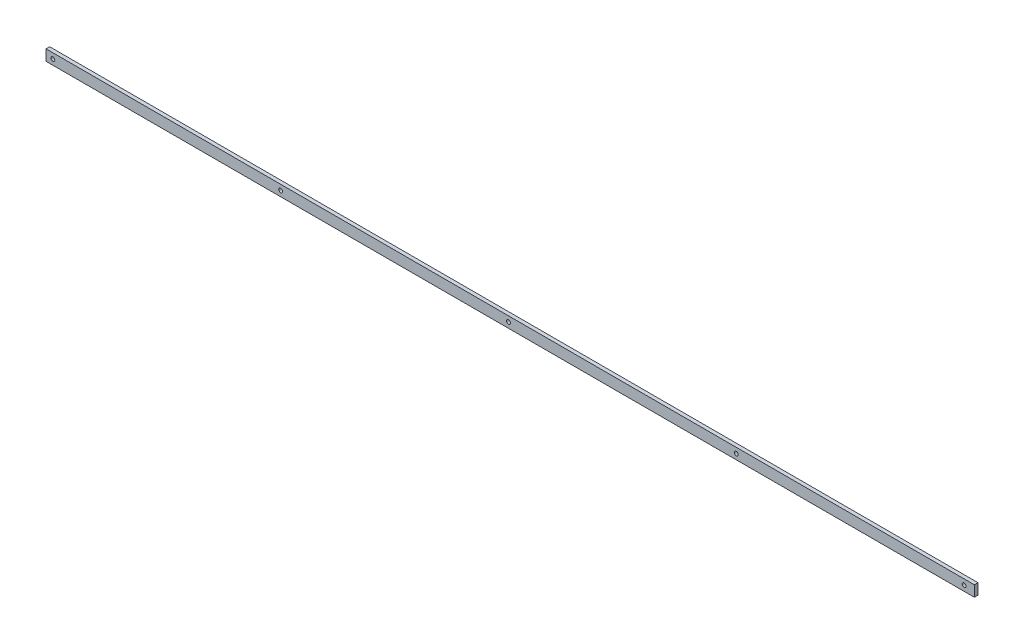
ISO-10303-21;
HEADER;
FILE_DESCRIPTION(('STEP AP214'),'2;1');
FILE_NAME('part.step','',(''),(''),'','','');
FILE_SCHEMA(('AUTOMOTIVE_DESIGN { 1 0 10303 214 1 1 1 1 }'));
ENDSEC;
DATA;
#1=APPLICATION_CONTEXT('core data for automotive mechanical design processes');
#2=APPLICATION_PROTOCOL_DEFINITION('international standard','automotive_design',2000,#1);
#3=PRODUCT_CONTEXT('',#1,'mechanical');
#4=PRODUCT('Part','Part','',(#3));
#5=PRODUCT_RELATED_PRODUCT_CATEGORY('part','',(#4));
#6=PRODUCT_DEFINITION_FORMATION('','',#4);
#7=PRODUCT_DEFINITION_CONTEXT('part definition',#1,'design');
#8=PRODUCT_DEFINITION('design','',#6,#7);
#9=PRODUCT_DEFINITION_SHAPE('','',#8);
#10=(LENGTH_UNIT() NAMED_UNIT(*) SI_UNIT(.MILLI.,.METRE.));
#11=(NAMED_UNIT(*) PLANE_ANGLE_UNIT() SI_UNIT($,.RADIAN.));
#12=(NAMED_UNIT(*) SI_UNIT($,.STERADIAN.) SOLID_ANGLE_UNIT());
#13=UNCERTAINTY_MEASURE_WITH_UNIT(LENGTH_MEASURE(1.E-05),#10,'distance_accuracy_value','');
#14=(GEOMETRIC_REPRESENTATION_CONTEXT(3) GLOBAL_UNCERTAINTY_ASSIGNED_CONTEXT((#13)) GLOBAL_UNIT_ASSIGNED_CONTEXT((#10,
#11,#12)) REPRESENTATION_CONTEXT('',''));
#15=CARTESIAN_POINT('',(0.,0.,0.));
#16=DIRECTION('',(0.,0.,1.));
#17=DIRECTION('',(1.,0.,0.));
#18=AXIS2_PLACEMENT_3D('',#15,#16,#17);
#19=CARTESIAN_POINT('',(-93.9029108738828,-23.0037735849057,6.35));
#20=DIRECTION('',(0.,1.,0.));
#21=DIRECTION('',(-1.,0.,0.));
#22=AXIS2_PLACEMENT_3D('',#19,#20,#21);
#23=PLANE('',#22);
#24=DIRECTION('',(1.,0.,0.));
#25=VECTOR('',#24,1.);
#26=CARTESIAN_POINT('',(-93.9029108738828,-23.0037735849057,0.));
#27=LINE('',#26,#25);
#28=CARTESIAN_POINT('',(-93.9029108738828,-23.0037735849057,0.));
#29=VERTEX_POINT('',#28);
#30=CARTESIAN_POINT('',(1536.09708912612,-23.0037735849057,0.));
#31=VERTEX_POINT('',#30);
#32=EDGE_CURVE('E101',#29,#31,#27,.T.);
#33=ORIENTED_EDGE('',*,*,#32,.T.);
#34=DIRECTION('',(0.,0.,-1.));
#35=VECTOR('',#34,1.);
#36=CARTESIAN_POINT('',(1536.09708912612,-23.0037735849057,6.35));
#37=LINE('',#36,#35);
#38=CARTESIAN_POINT('',(1536.09708912612,-23.0037735849057,6.35));
#39=VERTEX_POINT('',#38);
#40=EDGE_CURVE('E11',#39,#31,#37,.T.);
#41=ORIENTED_EDGE('',*,*,#40,.F.);
#42=DIRECTION('',(1.,0.,0.));
#43=VECTOR('',#42,1.);
#44=CARTESIAN_POINT('',(-93.9029108738828,-23.0037735849057,6.35));
#45=LINE('',#44,#43);
#46=CARTESIAN_POINT('',(-93.9029108738828,-23.0037735849057,6.35));
#47=VERTEX_POINT('',#46);
#48=EDGE_CURVE('E78',#47,#39,#45,.T.);
#49=ORIENTED_EDGE('',*,*,#48,.F.);
#50=DIRECTION('',(0.,0.,-1.));
#51=VECTOR('',#50,1.);
#52=CARTESIAN_POINT('',(-93.9029108738828,-23.0037735849057,6.35));
#53=LINE('',#52,#51);
#54=EDGE_CURVE('E54',#47,#29,#53,.T.);
#55=ORIENTED_EDGE('',*,*,#54,.T.);
#56=EDGE_LOOP('',(#33,#41,#49,#55));
#57=FACE_BOUND('',#56,.T.);
#58=ADVANCED_FACE('F38',(#57),#23,.F.);
#59=CARTESIAN_POINT('',(1536.09708912612,-3.95377358490566,6.35));
#60=DIRECTION('',(1.,0.,0.));
#61=DIRECTION('',(0.,0.,-1.));
#62=AXIS2_PLACEMENT_3D('',#59,#60,#61);
#63=PLANE('',#62);
#64=DIRECTION('',(0.,-1.,0.));
#65=VECTOR('',#64,1.);
#66=CARTESIAN_POINT('',(1536.09708912612,-3.95377358490566,0.));
#67=LINE('',#66,#65);
#68=CARTESIAN_POINT('',(1536.09708912612,-3.95377358490566,0.));
#69=VERTEX_POINT('',#68);
#70=EDGE_CURVE('E87',#69,#31,#67,.T.);
#71=ORIENTED_EDGE('',*,*,#70,.F.);
#72=DIRECTION('',(0.,0.,-1.));
#73=VECTOR('',#72,1.);
#74=CARTESIAN_POINT('',(1536.09708912612,-3.95377358490566,6.35));
#75=LINE('',#74,#73);
#76=CARTESIAN_POINT('',(1536.09708912612,-3.95377358490566,6.35));
#77=VERTEX_POINT('',#76);
#78=EDGE_CURVE('E46',#77,#69,#75,.T.);
#79=ORIENTED_EDGE('',*,*,#78,.F.);
#80=DIRECTION('',(0.,-1.,0.));
#81=VECTOR('',#80,1.);
#82=CARTESIAN_POINT('',(1536.09708912612,-3.95377358490566,6.35));
#83=LINE('',#82,#81);
#84=EDGE_CURVE('E85',#77,#39,#83,.T.);
#85=ORIENTED_EDGE('',*,*,#84,.T.);
#86=ORIENTED_EDGE('',*,*,#40,.T.);
#87=EDGE_LOOP('',(#71,#79,#85,#86));
#88=FACE_BOUND('',#87,.T.);
#89=ADVANCED_FACE('F84',(#88),#63,.T.);
#90=CARTESIAN_POINT('',(-93.9029108738828,-3.95377358490566,6.35));
#91=DIRECTION('',(0.,1.,0.));
#92=DIRECTION('',(-1.,0.,0.));
#93=AXIS2_PLACEMENT_3D('',#90,#91,#92);
#94=PLANE('',#93);
#95=DIRECTION('',(1.,0.,0.));
#96=VECTOR('',#95,1.);
#97=CARTESIAN_POINT('',(-93.9029108738828,-3.95377358490566,0.));
#98=LINE('',#97,#96);
#99=CARTESIAN_POINT('',(-93.9029108738828,-3.95377358490566,0.));
#100=VERTEX_POINT('',#99);
#101=EDGE_CURVE('E105',#100,#69,#98,.T.);
#102=ORIENTED_EDGE('',*,*,#101,.F.);
#103=DIRECTION('',(0.,0.,-1.));
#104=VECTOR('',#103,1.);
#105=CARTESIAN_POINT('',(-93.9029108738828,-3.95377358490566,6.35));
#106=LINE('',#105,#104);
#107=CARTESIAN_POINT('',(-93.9029108738828,-3.95377358490566,6.35));
#108=VERTEX_POINT('',#107);
#109=EDGE_CURVE('E67',#108,#100,#106,.T.);
#110=ORIENTED_EDGE('',*,*,#109,.F.);
#111=DIRECTION('',(1.,0.,0.));
#112=VECTOR('',#111,1.);
#113=CARTESIAN_POINT('',(-93.9029108738828,-3.95377358490566,6.35));
#114=LINE('',#113,#112);
#115=EDGE_CURVE('E93',#108,#77,#114,.T.);
#116=ORIENTED_EDGE('',*,*,#115,.T.);
#117=ORIENTED_EDGE('',*,*,#78,.T.);
#118=EDGE_LOOP('',(#102,#110,#116,#117));
#119=FACE_BOUND('',#118,.T.);
#120=ADVANCED_FACE('F95',(#119),#94,.T.);
#121=CARTESIAN_POINT('',(-93.9029108738828,-23.0037735849057,6.35));
#122=DIRECTION('',(-1.,0.,0.));
#123=DIRECTION('',(0.,0.,1.));
#124=AXIS2_PLACEMENT_3D('',#121,#122,#123);
#125=PLANE('',#124);
#126=DIRECTION('',(0.,1.,0.));
#127=VECTOR('',#126,1.);
#128=CARTESIAN_POINT('',(-93.9029108738828,-23.0037735849057,0.));
#129=LINE('',#128,#127);
#130=EDGE_CURVE('E107',#29,#100,#129,.T.);
#131=ORIENTED_EDGE('',*,*,#130,.F.);
#132=ORIENTED_EDGE('',*,*,#54,.F.);
#133=DIRECTION('',(0.,1.,0.));
#134=VECTOR('',#133,1.);
#135=CARTESIAN_POINT('',(-93.9029108738828,-23.0037735849057,6.35));
#136=LINE('',#135,#134);
#137=EDGE_CURVE('E96',#47,#108,#136,.T.);
#138=ORIENTED_EDGE('',*,*,#137,.T.);
#139=ORIENTED_EDGE('',*,*,#109,.T.);
#140=EDGE_LOOP('',(#131,#132,#138,#139));
#141=FACE_BOUND('',#140,.T.);
#142=ADVANCED_FACE('F149',(#141),#125,.T.);
#143=CARTESIAN_POINT('',(0.,0.,6.35));
#144=DIRECTION('',(0.,0.,-1.));
#145=DIRECTION('',(-1.,0.,0.));
#146=AXIS2_PLACEMENT_3D('',#143,#144,#145);
#147=PLANE('',#146);
#148=CARTESIAN_POINT('',(-81.9029108738828,-13.4787735849057,6.35));
#149=DIRECTION('',(0.,0.,1.));
#150=DIRECTION('',(1.,0.,0.));
#151=AXIS2_PLACEMENT_3D('',#148,#149,#150);
#152=CIRCLE('',#151,3.3782);
#153=CARTESIAN_POINT('',(-78.5247108738828,-13.4787735849057,6.35));
#154=VERTEX_POINT('',#153);
#155=EDGE_CURVE('E139',#154,#154,#152,.T.);
#156=ORIENTED_EDGE('',*,*,#155,.F.);
#157=EDGE_LOOP('',(#156));
#158=FACE_BOUND('',#157,.T.);
#159=CARTESIAN_POINT('',(318.097089126117,-13.4787735849057,6.35));
#160=DIRECTION('',(0.,0.,1.));
#161=DIRECTION('',(1.,0.,0.));
#162=AXIS2_PLACEMENT_3D('',#159,#160,#161);
#163=CIRCLE('',#162,3.3782);
#164=CARTESIAN_POINT('',(321.475289126117,-13.4787735849057,6.35));
#165=VERTEX_POINT('',#164);
#166=EDGE_CURVE('E133',#165,#165,#163,.T.);
#167=ORIENTED_EDGE('',*,*,#166,.F.);
#168=EDGE_LOOP('',(#167));
#169=FACE_BOUND('',#168,.T.);
#170=CARTESIAN_POINT('',(718.097089126117,-13.4787735849057,6.35));
#171=DIRECTION('',(0.,0.,1.));
#172=DIRECTION('',(1.,0.,0.));
#173=AXIS2_PLACEMENT_3D('',#170,#171,#172);
#174=CIRCLE('',#173,3.3782);
#175=CARTESIAN_POINT('',(721.475289126117,-13.4787735849057,6.35));
#176=VERTEX_POINT('',#175);
#177=EDGE_CURVE('E127',#176,#176,#174,.T.);
#178=ORIENTED_EDGE('',*,*,#177,.F.);
#179=EDGE_LOOP('',(#178));
#180=FACE_BOUND('',#179,.T.);
#181=CARTESIAN_POINT('',(1118.09708912612,-13.4787735849057,6.35));
#182=DIRECTION('',(0.,0.,1.));
#183=DIRECTION('',(1.,0.,0.));
#184=AXIS2_PLACEMENT_3D('',#181,#182,#183);
#185=CIRCLE('',#184,3.3782);
#186=CARTESIAN_POINT('',(1121.47528912612,-13.4787735849057,6.35));
#187=VERTEX_POINT('',#186);
#188=EDGE_CURVE('E121',#187,#187,#185,.T.);
#189=ORIENTED_EDGE('',*,*,#188,.F.);
#190=EDGE_LOOP('',(#189));
#191=FACE_BOUND('',#190,.T.);
#192=CARTESIAN_POINT('',(1518.09708912612,-13.4787735849057,6.35));
#193=DIRECTION('',(0.,0.,1.));
#194=DIRECTION('',(1.,0.,0.));
#195=AXIS2_PLACEMENT_3D('',#192,#193,#194);
#196=CIRCLE('',#195,3.3782);
#197=CARTESIAN_POINT('',(1521.47528912612,-13.4787735849057,6.35));
#198=VERTEX_POINT('',#197);
#199=EDGE_CURVE('E115',#198,#198,#196,.T.);
#200=ORIENTED_EDGE('',*,*,#199,.F.);
#201=EDGE_LOOP('',(#200));
#202=FACE_BOUND('',#201,.T.);
#203=ORIENTED_EDGE('',*,*,#48,.T.);
#204=ORIENTED_EDGE('',*,*,#84,.F.);
#205=ORIENTED_EDGE('',*,*,#115,.F.);
#206=ORIENTED_EDGE('',*,*,#137,.F.);
#207=EDGE_LOOP('',(#203,#204,#205,#206));
#208=FACE_BOUND('',#207,.T.);
#209=ADVANCED_FACE('F92',(#158,#169,#180,#191,#202,#208),#147,.F.);
#210=CARTESIAN_POINT('',(0.,0.,0.));
#211=DIRECTION('',(0.,0.,-1.));
#212=DIRECTION('',(-1.,0.,0.));
#213=AXIS2_PLACEMENT_3D('',#210,#211,#212);
#214=PLANE('',#213);
#215=CARTESIAN_POINT('',(-81.9029108738828,-13.4787735849057,0.));
#216=DIRECTION('',(0.,0.,-1.));
#217=DIRECTION('',(-1.,0.,0.));
#218=AXIS2_PLACEMENT_3D('',#215,#216,#217);
#219=CIRCLE('',#218,3.3782);
#220=CARTESIAN_POINT('',(-85.2811108738828,-13.4787735849057,0.));
#221=VERTEX_POINT('',#220);
#222=EDGE_CURVE('E136',#221,#221,#219,.T.);
#223=ORIENTED_EDGE('',*,*,#222,.F.);
#224=EDGE_LOOP('',(#223));
#225=FACE_BOUND('',#224,.T.);
#226=CARTESIAN_POINT('',(318.097089126117,-13.4787735849057,0.));
#227=DIRECTION('',(0.,0.,-1.));
#228=DIRECTION('',(-1.,0.,0.));
#229=AXIS2_PLACEMENT_3D('',#226,#227,#228);
#230=CIRCLE('',#229,3.3782);
#231=CARTESIAN_POINT('',(314.718889126117,-13.4787735849057,0.));
#232=VERTEX_POINT('',#231);
#233=EDGE_CURVE('E130',#232,#232,#230,.T.);
#234=ORIENTED_EDGE('',*,*,#233,.F.);
#235=EDGE_LOOP('',(#234));
#236=FACE_BOUND('',#235,.T.);
#237=CARTESIAN_POINT('',(718.097089126117,-13.4787735849057,0.));
#238=DIRECTION('',(0.,0.,-1.));
#239=DIRECTION('',(-1.,0.,0.));
#240=AXIS2_PLACEMENT_3D('',#237,#238,#239);
#241=CIRCLE('',#240,3.3782);
#242=CARTESIAN_POINT('',(714.718889126117,-13.4787735849057,0.));
#243=VERTEX_POINT('',#242);
#244=EDGE_CURVE('E124',#243,#243,#241,.T.);
#245=ORIENTED_EDGE('',*,*,#244,.F.);
#246=EDGE_LOOP('',(#245));
#247=FACE_BOUND('',#246,.T.);
#248=CARTESIAN_POINT('',(1118.09708912612,-13.4787735849057,0.));
#249=DIRECTION('',(0.,0.,-1.));
#250=DIRECTION('',(-1.,0.,0.));
#251=AXIS2_PLACEMENT_3D('',#248,#249,#250);
#252=CIRCLE('',#251,3.3782);
#253=CARTESIAN_POINT('',(1114.71888912612,-13.4787735849057,0.));
#254=VERTEX_POINT('',#253);
#255=EDGE_CURVE('E118',#254,#254,#252,.T.);
#256=ORIENTED_EDGE('',*,*,#255,.F.);
#257=EDGE_LOOP('',(#256));
#258=FACE_BOUND('',#257,.T.);
#259=CARTESIAN_POINT('',(1518.09708912612,-13.4787735849057,0.));
#260=DIRECTION('',(0.,0.,-1.));
#261=DIRECTION('',(-1.,0.,0.));
#262=AXIS2_PLACEMENT_3D('',#259,#260,#261);
#263=CIRCLE('',#262,3.3782);
#264=CARTESIAN_POINT('',(1514.71888912612,-13.4787735849057,0.));
#265=VERTEX_POINT('',#264);
#266=EDGE_CURVE('E103',#265,#265,#263,.T.);
#267=ORIENTED_EDGE('',*,*,#266,.F.);
#268=EDGE_LOOP('',(#267));
#269=FACE_BOUND('',#268,.T.);
#270=ORIENTED_EDGE('',*,*,#32,.F.);
#271=ORIENTED_EDGE('',*,*,#130,.T.);
#272=ORIENTED_EDGE('',*,*,#101,.T.);
#273=ORIENTED_EDGE('',*,*,#70,.T.);
#274=EDGE_LOOP('',(#270,#271,#272,#273));
#275=FACE_BOUND('',#274,.T.);
#276=ADVANCED_FACE('F148',(#225,#236,#247,#258,#269,#275),#214,.T.);
#277=CARTESIAN_POINT('',(1518.09708912612,-13.4787735849057,6.35));
#278=DIRECTION('',(0.,0.,1.));
#279=DIRECTION('',(1.,0.,0.));
#280=AXIS2_PLACEMENT_3D('',#277,#278,#279);
#281=CYLINDRICAL_SURFACE('',#280,3.3782);
#282=ORIENTED_EDGE('',*,*,#199,.T.);
#283=EDGE_LOOP('',(#282));
#284=FACE_BOUND('',#283,.T.);
#285=ORIENTED_EDGE('',*,*,#266,.T.);
#286=EDGE_LOOP('',(#285));
#287=FACE_BOUND('',#286,.T.);
#288=ADVANCED_FACE('F159',(#284,#287),#281,.F.);
#289=CARTESIAN_POINT('',(1118.09708912612,-13.4787735849057,6.35));
#290=DIRECTION('',(0.,0.,1.));
#291=DIRECTION('',(1.,0.,0.));
#292=AXIS2_PLACEMENT_3D('',#289,#290,#291);
#293=CYLINDRICAL_SURFACE('',#292,3.3782);
#294=ORIENTED_EDGE('',*,*,#188,.T.);
#295=EDGE_LOOP('',(#294));
#296=FACE_BOUND('',#295,.T.);
#297=ORIENTED_EDGE('',*,*,#255,.T.);
#298=EDGE_LOOP('',(#297));
#299=FACE_BOUND('',#298,.T.);
#300=ADVANCED_FACE('F162',(#296,#299),#293,.F.);
#301=CARTESIAN_POINT('',(718.097089126117,-13.4787735849057,6.35));
#302=DIRECTION('',(0.,0.,1.));
#303=DIRECTION('',(1.,0.,0.));
#304=AXIS2_PLACEMENT_3D('',#301,#302,#303);
#305=CYLINDRICAL_SURFACE('',#304,3.3782);
#306=ORIENTED_EDGE('',*,*,#177,.T.);
#307=EDGE_LOOP('',(#306));
#308=FACE_BOUND('',#307,.T.);
#309=ORIENTED_EDGE('',*,*,#244,.T.);
#310=EDGE_LOOP('',(#309));
#311=FACE_BOUND('',#310,.T.);
#312=ADVANCED_FACE('F220',(#308,#311),#305,.F.);
#313=CARTESIAN_POINT('',(318.097089126117,-13.4787735849057,6.35));
#314=DIRECTION('',(0.,0.,1.));
#315=DIRECTION('',(1.,0.,0.));
#316=AXIS2_PLACEMENT_3D('',#313,#314,#315);
#317=CYLINDRICAL_SURFACE('',#316,3.3782);
#318=ORIENTED_EDGE('',*,*,#166,.T.);
#319=EDGE_LOOP('',(#318));
#320=FACE_BOUND('',#319,.T.);
#321=ORIENTED_EDGE('',*,*,#233,.T.);
#322=EDGE_LOOP('',(#321));
#323=FACE_BOUND('',#322,.T.);
#324=ADVANCED_FACE('F230',(#320,#323),#317,.F.);
#325=CARTESIAN_POINT('',(-81.9029108738828,-13.4787735849057,6.35));
#326=DIRECTION('',(0.,0.,1.));
#327=DIRECTION('',(1.,0.,0.));
#328=AXIS2_PLACEMENT_3D('',#325,#326,#327);
#329=CYLINDRICAL_SURFACE('',#328,3.3782);
#330=ORIENTED_EDGE('',*,*,#155,.T.);
#331=EDGE_LOOP('',(#330));
#332=FACE_BOUND('',#331,.T.);
#333=ORIENTED_EDGE('',*,*,#222,.T.);
#334=EDGE_LOOP('',(#333));
#335=FACE_BOUND('',#334,.T.);
#336=ADVANCED_FACE('F143',(#332,#335),#329,.F.);
#337=CLOSED_SHELL('',(#58,#89,#120,#142,#209,#276,#288,#300,#312,#324,#336));
#338=MANIFOLD_SOLID_BREP('B2',#337);
#339=ADVANCED_BREP_SHAPE_REPRESENTATION('',(#18,#338),#14);
#340=SHAPE_DEFINITION_REPRESENTATION(#9,#339);
ENDSEC;
END-ISO-10303-21;
